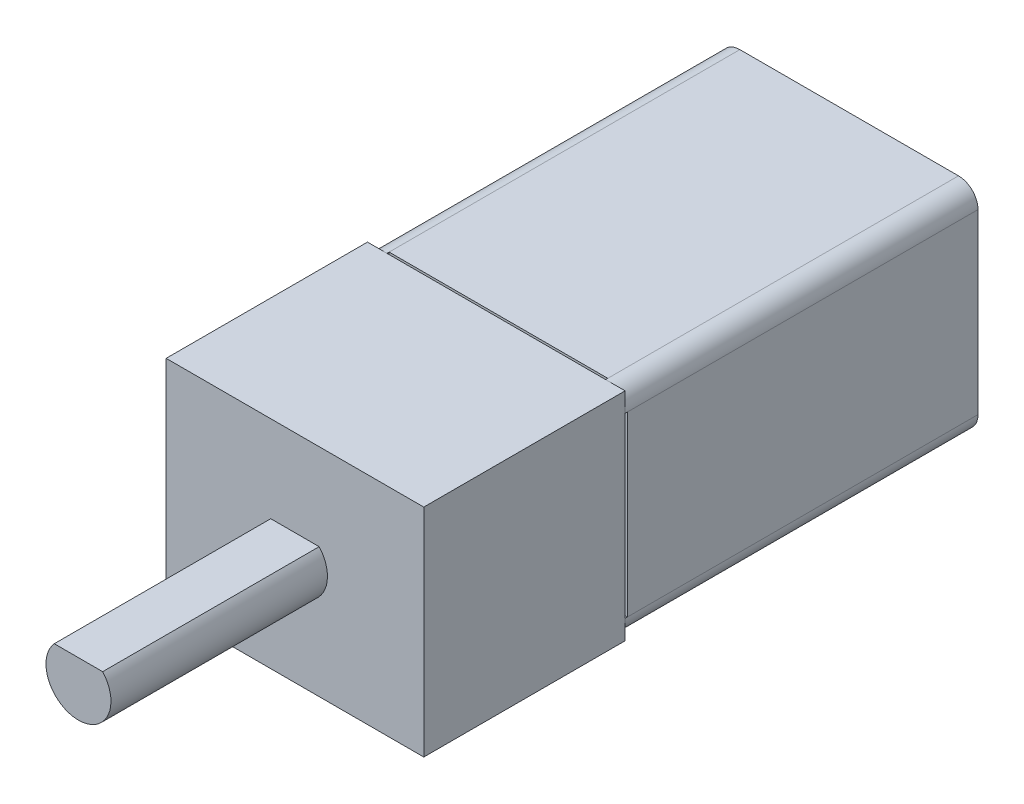
ISO-10303-21;
HEADER;
FILE_DESCRIPTION(('STEP AP214'),'2;1');
FILE_NAME('part.step','',(''),(''),'','','');
FILE_SCHEMA(('AUTOMOTIVE_DESIGN { 1 0 10303 214 1 1 1 1 }'));
ENDSEC;
DATA;
#1=APPLICATION_CONTEXT('core data for automotive mechanical design processes');
#2=APPLICATION_PROTOCOL_DEFINITION('international standard','automotive_design',2000,#1);
#3=PRODUCT_CONTEXT('',#1,'mechanical');
#4=PRODUCT('Part','Part','',(#3));
#5=PRODUCT_RELATED_PRODUCT_CATEGORY('part','',(#4));
#6=PRODUCT_DEFINITION_FORMATION('','',#4);
#7=PRODUCT_DEFINITION_CONTEXT('part definition',#1,'design');
#8=PRODUCT_DEFINITION('design','',#6,#7);
#9=PRODUCT_DEFINITION_SHAPE('','',#8);
#10=(LENGTH_UNIT() NAMED_UNIT(*) SI_UNIT(.MILLI.,.METRE.));
#11=(NAMED_UNIT(*) PLANE_ANGLE_UNIT() SI_UNIT($,.RADIAN.));
#12=(NAMED_UNIT(*) SI_UNIT($,.STERADIAN.) SOLID_ANGLE_UNIT());
#13=UNCERTAINTY_MEASURE_WITH_UNIT(LENGTH_MEASURE(1.E-05),#10,'distance_accuracy_value','');
#14=(GEOMETRIC_REPRESENTATION_CONTEXT(3) GLOBAL_UNCERTAINTY_ASSIGNED_CONTEXT((#13)) GLOBAL_UNIT_ASSIGNED_CONTEXT((#10,
#11,#12)) REPRESENTATION_CONTEXT('',''));
#15=CARTESIAN_POINT('',(0.,0.,0.));
#16=DIRECTION('',(0.,0.,1.));
#17=DIRECTION('',(1.,0.,0.));
#18=AXIS2_PLACEMENT_3D('',#15,#16,#17);
#19=CARTESIAN_POINT('',(0.,0.,0.));
#20=DIRECTION('',(0.,-1.,0.));
#21=DIRECTION('',(0.,0.,-1.));
#22=AXIS2_PLACEMENT_3D('',#19,#20,#21);
#23=PLANE('',#22);
#24=DIRECTION('',(1.,0.,0.));
#25=VECTOR('',#24,1.);
#26=CARTESIAN_POINT('',(11.,0.,-9.4));
#27=LINE('',#26,#25);
#28=CARTESIAN_POINT('',(0.900000000000006,0.,-9.4));
#29=VERTEX_POINT('',#28);
#30=CARTESIAN_POINT('',(11.,0.,-9.4));
#31=VERTEX_POINT('',#30);
#32=EDGE_CURVE('E231',#29,#31,#27,.T.);
#33=ORIENTED_EDGE('',*,*,#32,.F.);
#34=DIRECTION('',(0.,0.,1.));
#35=VECTOR('',#34,1.);
#36=CARTESIAN_POINT('',(0.900000000000006,0.,-25.6));
#37=LINE('',#36,#35);
#38=CARTESIAN_POINT('',(0.900000000000006,0.,-25.6));
#39=VERTEX_POINT('',#38);
#40=EDGE_CURVE('E382',#39,#29,#37,.T.);
#41=ORIENTED_EDGE('',*,*,#40,.F.);
#42=DIRECTION('',(-1.,0.,0.));
#43=VECTOR('',#42,1.);
#44=CARTESIAN_POINT('',(11.,0.,-25.6));
#45=LINE('',#44,#43);
#46=CARTESIAN_POINT('',(11.,0.,-25.6));
#47=VERTEX_POINT('',#46);
#48=EDGE_CURVE('E350',#47,#39,#45,.T.);
#49=ORIENTED_EDGE('',*,*,#48,.F.);
#50=DIRECTION('',(0.,0.,1.));
#51=VECTOR('',#50,1.);
#52=CARTESIAN_POINT('',(11.,0.,-25.6));
#53=LINE('',#52,#51);
#54=EDGE_CURVE('E385',#47,#31,#53,.T.);
#55=ORIENTED_EDGE('',*,*,#54,.T.);
#56=EDGE_LOOP('',(#33,#41,#49,#55));
#57=FACE_BOUND('',#56,.T.);
#58=ADVANCED_FACE('F34',(#57),#23,.T.);
#59=CARTESIAN_POINT('',(0.,10.,0.));
#60=DIRECTION('',(1.,0.,0.));
#61=DIRECTION('',(0.,0.,-1.));
#62=AXIS2_PLACEMENT_3D('',#59,#60,#61);
#63=PLANE('',#62);
#64=DIRECTION('',(0.,-1.,0.));
#65=VECTOR('',#64,1.);
#66=CARTESIAN_POINT('',(0.,10.,-9.3));
#67=LINE('',#66,#65);
#68=CARTESIAN_POINT('',(0.,10.,-9.3));
#69=VERTEX_POINT('',#68);
#70=CARTESIAN_POINT('',(0.,9.1,-9.3));
#71=VERTEX_POINT('',#70);
#72=EDGE_CURVE('E435',#69,#71,#67,.T.);
#73=ORIENTED_EDGE('',*,*,#72,.T.);
#74=DIRECTION('',(0.,1.,0.));
#75=VECTOR('',#74,1.);
#76=CARTESIAN_POINT('',(0.,0.9,-9.3));
#77=LINE('',#76,#75);
#78=CARTESIAN_POINT('',(0.,0.9,-9.3));
#79=VERTEX_POINT('',#78);
#80=EDGE_CURVE('E246',#79,#71,#77,.T.);
#81=ORIENTED_EDGE('',*,*,#80,.F.);
#82=CARTESIAN_POINT('',(0.,0.,-9.3));
#83=VERTEX_POINT('',#82);
#84=EDGE_CURVE('E424',#79,#83,#67,.T.);
#85=ORIENTED_EDGE('',*,*,#84,.T.);
#86=DIRECTION('',(0.,0.,1.));
#87=VECTOR('',#86,1.);
#88=CARTESIAN_POINT('',(0.,0.,0.));
#89=LINE('',#88,#87);
#90=CARTESIAN_POINT('',(0.,0.,0.));
#91=VERTEX_POINT('',#90);
#92=EDGE_CURVE('E411',#83,#91,#89,.T.);
#93=ORIENTED_EDGE('',*,*,#92,.T.);
#94=DIRECTION('',(0.,-1.,0.));
#95=VECTOR('',#94,1.);
#96=CARTESIAN_POINT('',(0.,10.,0.));
#97=LINE('',#96,#95);
#98=CARTESIAN_POINT('',(0.,10.,0.));
#99=VERTEX_POINT('',#98);
#100=EDGE_CURVE('E11',#99,#91,#97,.T.);
#101=ORIENTED_EDGE('',*,*,#100,.F.);
#102=DIRECTION('',(0.,0.,1.));
#103=VECTOR('',#102,1.);
#104=CARTESIAN_POINT('',(0.,10.,0.));
#105=LINE('',#104,#103);
#106=EDGE_CURVE('E412',#69,#99,#105,.T.);
#107=ORIENTED_EDGE('',*,*,#106,.F.);
#108=EDGE_LOOP('',(#73,#81,#85,#93,#101,#107));
#109=FACE_BOUND('',#108,.T.);
#110=ADVANCED_FACE('F496',(#109),#63,.F.);
#111=CARTESIAN_POINT('',(11.9,10.,0.));
#112=DIRECTION('',(-1.,0.,0.));
#113=DIRECTION('',(0.,0.,1.));
#114=AXIS2_PLACEMENT_3D('',#111,#112,#113);
#115=PLANE('',#114);
#116=DIRECTION('',(0.,-1.,0.));
#117=VECTOR('',#116,1.);
#118=CARTESIAN_POINT('',(11.9,10.,-9.3));
#119=LINE('',#118,#117);
#120=CARTESIAN_POINT('',(11.9,0.9,-9.3));
#121=VERTEX_POINT('',#120);
#122=CARTESIAN_POINT('',(11.9,0.,-9.3));
#123=VERTEX_POINT('',#122);
#124=EDGE_CURVE('E438',#121,#123,#119,.T.);
#125=ORIENTED_EDGE('',*,*,#124,.F.);
#126=DIRECTION('',(0.,-1.,0.));
#127=VECTOR('',#126,1.);
#128=CARTESIAN_POINT('',(11.9,9.1,-9.3));
#129=LINE('',#128,#127);
#130=CARTESIAN_POINT('',(11.9,9.1,-9.3));
#131=VERTEX_POINT('',#130);
#132=EDGE_CURVE('E57',#131,#121,#129,.T.);
#133=ORIENTED_EDGE('',*,*,#132,.F.);
#134=CARTESIAN_POINT('',(11.9,10.,-9.3));
#135=VERTEX_POINT('',#134);
#136=EDGE_CURVE('E439',#135,#131,#119,.T.);
#137=ORIENTED_EDGE('',*,*,#136,.F.);
#138=DIRECTION('',(0.,0.,-1.));
#139=VECTOR('',#138,1.);
#140=CARTESIAN_POINT('',(11.9,10.,0.));
#141=LINE('',#140,#139);
#142=CARTESIAN_POINT('',(11.9,10.,0.));
#143=VERTEX_POINT('',#142);
#144=EDGE_CURVE('E418',#143,#135,#141,.T.);
#145=ORIENTED_EDGE('',*,*,#144,.F.);
#146=DIRECTION('',(0.,-1.,0.));
#147=VECTOR('',#146,1.);
#148=CARTESIAN_POINT('',(11.9,10.,0.));
#149=LINE('',#148,#147);
#150=CARTESIAN_POINT('',(11.9,0.,0.));
#151=VERTEX_POINT('',#150);
#152=EDGE_CURVE('E42',#143,#151,#149,.T.);
#153=ORIENTED_EDGE('',*,*,#152,.T.);
#154=DIRECTION('',(0.,0.,-1.));
#155=VECTOR('',#154,1.);
#156=CARTESIAN_POINT('',(11.9,0.,0.));
#157=LINE('',#156,#155);
#158=EDGE_CURVE('E429',#151,#123,#157,.T.);
#159=ORIENTED_EDGE('',*,*,#158,.T.);
#160=EDGE_LOOP('',(#125,#133,#137,#145,#153,#159));
#161=FACE_BOUND('',#160,.T.);
#162=ADVANCED_FACE('F447',(#161),#115,.F.);
#163=CARTESIAN_POINT('',(0.,10.,0.));
#164=DIRECTION('',(0.,-1.,0.));
#165=DIRECTION('',(0.,0.,-1.));
#166=AXIS2_PLACEMENT_3D('',#163,#164,#165);
#167=PLANE('',#166);
#168=DIRECTION('',(0.,0.,1.));
#169=VECTOR('',#168,1.);
#170=CARTESIAN_POINT('',(0.900000000000006,10.,-25.6));
#171=LINE('',#170,#169);
#172=CARTESIAN_POINT('',(0.900000000000006,10.,-25.6));
#173=VERTEX_POINT('',#172);
#174=CARTESIAN_POINT('',(0.900000000000006,10.,-9.4));
#175=VERTEX_POINT('',#174);
#176=EDGE_CURVE('E373',#173,#175,#171,.T.);
#177=ORIENTED_EDGE('',*,*,#176,.T.);
#178=DIRECTION('',(-1.,0.,0.));
#179=VECTOR('',#178,1.);
#180=CARTESIAN_POINT('',(0.9,10.,-9.4));
#181=LINE('',#180,#179);
#182=CARTESIAN_POINT('',(11.,10.,-9.4));
#183=VERTEX_POINT('',#182);
#184=EDGE_CURVE('E49',#183,#175,#181,.T.);
#185=ORIENTED_EDGE('',*,*,#184,.F.);
#186=DIRECTION('',(0.,0.,1.));
#187=VECTOR('',#186,1.);
#188=CARTESIAN_POINT('',(11.,10.,-25.6));
#189=LINE('',#188,#187);
#190=CARTESIAN_POINT('',(11.,10.,-25.6));
#191=VERTEX_POINT('',#190);
#192=EDGE_CURVE('E360',#191,#183,#189,.T.);
#193=ORIENTED_EDGE('',*,*,#192,.F.);
#194=DIRECTION('',(1.,0.,0.));
#195=VECTOR('',#194,1.);
#196=CARTESIAN_POINT('',(11.,10.,-25.6));
#197=LINE('',#196,#195);
#198=EDGE_CURVE('E358',#173,#191,#197,.T.);
#199=ORIENTED_EDGE('',*,*,#198,.F.);
#200=EDGE_LOOP('',(#177,#185,#193,#199));
#201=FACE_BOUND('',#200,.T.);
#202=ADVANCED_FACE('F543',(#201),#167,.F.);
#203=CARTESIAN_POINT('',(0.,10.,-9.3));
#204=DIRECTION('',(0.,0.,1.));
#205=DIRECTION('',(1.,0.,0.));
#206=AXIS2_PLACEMENT_3D('',#203,#204,#205);
#207=PLANE('',#206);
#208=CARTESIAN_POINT('',(11.,9.1,-9.3));
#209=DIRECTION('',(0.,0.,-1.));
#210=DIRECTION('',(1.,0.,0.));
#211=AXIS2_PLACEMENT_3D('',#208,#209,#210);
#212=CIRCLE('',#211,0.9);
#213=CARTESIAN_POINT('',(11.,10.,-9.3));
#214=VERTEX_POINT('',#213);
#215=EDGE_CURVE('E336',#214,#131,#212,.T.);
#216=ORIENTED_EDGE('',*,*,#215,.F.);
#217=DIRECTION('',(-1.,0.,0.));
#218=VECTOR('',#217,1.);
#219=CARTESIAN_POINT('',(0.,10.,-9.3));
#220=LINE('',#219,#218);
#221=EDGE_CURVE('E421',#135,#214,#220,.T.);
#222=ORIENTED_EDGE('',*,*,#221,.F.);
#223=ORIENTED_EDGE('',*,*,#136,.T.);
#224=EDGE_LOOP('',(#216,#222,#223));
#225=FACE_BOUND('',#224,.T.);
#226=ADVANCED_FACE('F486',(#225),#207,.F.);
#227=CARTESIAN_POINT('',(0.9,9.1,-9.3));
#228=DIRECTION('',(0.,0.,-1.));
#229=DIRECTION('',(-1.,0.,0.));
#230=AXIS2_PLACEMENT_3D('',#227,#228,#229);
#231=CIRCLE('',#230,0.9);
#232=CARTESIAN_POINT('',(0.9,10.,-9.3));
#233=VERTEX_POINT('',#232);
#234=EDGE_CURVE('E346',#71,#233,#231,.T.);
#235=ORIENTED_EDGE('',*,*,#234,.F.);
#236=ORIENTED_EDGE('',*,*,#72,.F.);
#237=EDGE_CURVE('E420',#233,#69,#220,.T.);
#238=ORIENTED_EDGE('',*,*,#237,.F.);
#239=EDGE_LOOP('',(#235,#236,#238));
#240=FACE_BOUND('',#239,.T.);
#241=ADVANCED_FACE('F553',(#240),#207,.F.);
#242=CARTESIAN_POINT('',(0.9,0.9,-9.3));
#243=DIRECTION('',(0.,0.,-1.));
#244=DIRECTION('',(1.,0.,0.));
#245=AXIS2_PLACEMENT_3D('',#242,#243,#244);
#246=CIRCLE('',#245,0.9);
#247=CARTESIAN_POINT('',(0.9,0.,-9.3));
#248=VERTEX_POINT('',#247);
#249=EDGE_CURVE('E366',#248,#79,#246,.T.);
#250=ORIENTED_EDGE('',*,*,#249,.F.);
#251=DIRECTION('',(-1.,0.,0.));
#252=VECTOR('',#251,1.);
#253=CARTESIAN_POINT('',(0.,0.,-9.3));
#254=LINE('',#253,#252);
#255=EDGE_CURVE('E432',#248,#83,#254,.T.);
#256=ORIENTED_EDGE('',*,*,#255,.T.);
#257=ORIENTED_EDGE('',*,*,#84,.F.);
#258=EDGE_LOOP('',(#250,#256,#257));
#259=FACE_BOUND('',#258,.T.);
#260=ADVANCED_FACE('F502',(#259),#207,.F.);
#261=CARTESIAN_POINT('',(0.,10.,0.));
#262=DIRECTION('',(0.,0.,-1.));
#263=DIRECTION('',(-1.,0.,0.));
#264=AXIS2_PLACEMENT_3D('',#261,#262,#263);
#265=PLANE('',#264);
#266=DIRECTION('',(1.,0.,0.));
#267=VECTOR('',#266,1.);
#268=CARTESIAN_POINT('',(0.,0.,0.));
#269=LINE('',#268,#267);
#270=EDGE_CURVE('E427',#91,#151,#269,.T.);
#271=ORIENTED_EDGE('',*,*,#270,.T.);
#272=ORIENTED_EDGE('',*,*,#152,.F.);
#273=DIRECTION('',(1.,0.,0.));
#274=VECTOR('',#273,1.);
#275=CARTESIAN_POINT('',(0.,10.,0.));
#276=LINE('',#275,#274);
#277=EDGE_CURVE('E415',#99,#143,#276,.T.);
#278=ORIENTED_EDGE('',*,*,#277,.F.);
#279=ORIENTED_EDGE('',*,*,#100,.T.);
#280=EDGE_LOOP('',(#271,#272,#278,#279));
#281=FACE_BOUND('',#280,.T.);
#282=CARTESIAN_POINT('',(5.95,5.,0.));
#283=DIRECTION('',(0.,0.,1.));
#284=DIRECTION('',(1.,0.,0.));
#285=AXIS2_PLACEMENT_3D('',#282,#283,#284);
#286=CIRCLE('',#285,1.5);
#287=CARTESIAN_POINT('',(4.83196601125011,6.,0.));
#288=VERTEX_POINT('',#287);
#289=CARTESIAN_POINT('',(7.0680339887499,6.,0.));
#290=VERTEX_POINT('',#289);
#291=EDGE_CURVE('E394',#288,#290,#286,.T.);
#292=ORIENTED_EDGE('',*,*,#291,.F.);
#293=DIRECTION('',(-1.,0.,0.));
#294=VECTOR('',#293,1.);
#295=CARTESIAN_POINT('',(4.83196601125011,6.,0.));
#296=LINE('',#295,#294);
#297=EDGE_CURVE('E399',#290,#288,#296,.T.);
#298=ORIENTED_EDGE('',*,*,#297,.F.);
#299=EDGE_LOOP('',(#292,#298));
#300=FACE_BOUND('',#299,.T.);
#301=ADVANCED_FACE('F493',(#281,#300),#265,.F.);
#302=DIRECTION('',(0.,0.,1.));
#303=VECTOR('',#302,1.);
#304=CARTESIAN_POINT('',(0.,0.900000000000006,-25.6));
#305=LINE('',#304,#303);
#306=CARTESIAN_POINT('',(0.,0.900000000000006,-25.6));
#307=VERTEX_POINT('',#306);
#308=CARTESIAN_POINT('',(0.,0.9,-9.4));
#309=VERTEX_POINT('',#308);
#310=EDGE_CURVE('E379',#307,#309,#305,.T.);
#311=ORIENTED_EDGE('',*,*,#310,.T.);
#312=DIRECTION('',(0.,-1.,0.));
#313=VECTOR('',#312,1.);
#314=CARTESIAN_POINT('',(0.,0.9,-9.4));
#315=LINE('',#314,#313);
#316=CARTESIAN_POINT('',(0.,9.09999999999999,-9.4));
#317=VERTEX_POINT('',#316);
#318=EDGE_CURVE('E268',#317,#309,#315,.T.);
#319=ORIENTED_EDGE('',*,*,#318,.F.);
#320=DIRECTION('',(0.,0.,1.));
#321=VECTOR('',#320,1.);
#322=CARTESIAN_POINT('',(0.,9.09999999999999,-25.6));
#323=LINE('',#322,#321);
#324=CARTESIAN_POINT('',(0.,9.09999999999999,-25.6));
#325=VERTEX_POINT('',#324);
#326=EDGE_CURVE('E376',#325,#317,#323,.T.);
#327=ORIENTED_EDGE('',*,*,#326,.F.);
#328=DIRECTION('',(0.,1.,0.));
#329=VECTOR('',#328,1.);
#330=CARTESIAN_POINT('',(0.,9.09999999999999,-25.6));
#331=LINE('',#330,#329);
#332=EDGE_CURVE('E354',#307,#325,#331,.T.);
#333=ORIENTED_EDGE('',*,*,#332,.F.);
#334=EDGE_LOOP('',(#311,#319,#327,#333));
#335=FACE_BOUND('',#334,.T.);
#336=ADVANCED_FACE('F36',(#335),#63,.F.);
#337=DIRECTION('',(0.,0.,1.));
#338=VECTOR('',#337,1.);
#339=CARTESIAN_POINT('',(11.9,9.09999999999999,-25.6));
#340=LINE('',#339,#338);
#341=CARTESIAN_POINT('',(11.9,9.09999999999999,-25.6));
#342=VERTEX_POINT('',#341);
#343=CARTESIAN_POINT('',(11.9,9.1,-9.4));
#344=VERTEX_POINT('',#343);
#345=EDGE_CURVE('E391',#342,#344,#340,.T.);
#346=ORIENTED_EDGE('',*,*,#345,.T.);
#347=DIRECTION('',(0.,1.,0.));
#348=VECTOR('',#347,1.);
#349=CARTESIAN_POINT('',(11.9,9.1,-9.4));
#350=LINE('',#349,#348);
#351=CARTESIAN_POINT('',(11.9,0.900000000000006,-9.4));
#352=VERTEX_POINT('',#351);
#353=EDGE_CURVE('E299',#352,#344,#350,.T.);
#354=ORIENTED_EDGE('',*,*,#353,.F.);
#355=DIRECTION('',(0.,0.,1.));
#356=VECTOR('',#355,1.);
#357=CARTESIAN_POINT('',(11.9,0.900000000000006,-25.6));
#358=LINE('',#357,#356);
#359=CARTESIAN_POINT('',(11.9,0.900000000000006,-25.6));
#360=VERTEX_POINT('',#359);
#361=EDGE_CURVE('E388',#360,#352,#358,.T.);
#362=ORIENTED_EDGE('',*,*,#361,.F.);
#363=DIRECTION('',(0.,-1.,0.));
#364=VECTOR('',#363,1.);
#365=CARTESIAN_POINT('',(11.9,9.09999999999999,-25.6));
#366=LINE('',#365,#364);
#367=EDGE_CURVE('E345',#342,#360,#366,.T.);
#368=ORIENTED_EDGE('',*,*,#367,.F.);
#369=EDGE_LOOP('',(#346,#354,#362,#368));
#370=FACE_BOUND('',#369,.T.);
#371=ADVANCED_FACE('F470',(#370),#115,.F.);
#372=CARTESIAN_POINT('',(11.,0.9,-9.3));
#373=DIRECTION('',(0.,0.,-1.));
#374=DIRECTION('',(1.,0.,0.));
#375=AXIS2_PLACEMENT_3D('',#372,#373,#374);
#376=CIRCLE('',#375,0.9);
#377=CARTESIAN_POINT('',(11.,0.,-9.3));
#378=VERTEX_POINT('',#377);
#379=EDGE_CURVE('E363',#121,#378,#376,.T.);
#380=ORIENTED_EDGE('',*,*,#379,.F.);
#381=ORIENTED_EDGE('',*,*,#124,.T.);
#382=EDGE_CURVE('E416',#123,#378,#254,.T.);
#383=ORIENTED_EDGE('',*,*,#382,.T.);
#384=EDGE_LOOP('',(#380,#381,#383));
#385=FACE_BOUND('',#384,.T.);
#386=ADVANCED_FACE('F457',(#385),#207,.F.);
#387=ORIENTED_EDGE('',*,*,#221,.T.);
#388=DIRECTION('',(1.,0.,0.));
#389=VECTOR('',#388,1.);
#390=CARTESIAN_POINT('',(0.9,10.,-9.3));
#391=LINE('',#390,#389);
#392=EDGE_CURVE('E327',#233,#214,#391,.T.);
#393=ORIENTED_EDGE('',*,*,#392,.F.);
#394=ORIENTED_EDGE('',*,*,#237,.T.);
#395=ORIENTED_EDGE('',*,*,#106,.T.);
#396=ORIENTED_EDGE('',*,*,#277,.T.);
#397=ORIENTED_EDGE('',*,*,#144,.T.);
#398=EDGE_LOOP('',(#387,#393,#394,#395,#396,#397));
#399=FACE_BOUND('',#398,.T.);
#400=ADVANCED_FACE('F489',(#399),#167,.F.);
#401=DIRECTION('',(-1.,0.,0.));
#402=VECTOR('',#401,1.);
#403=CARTESIAN_POINT('',(11.,0.,-9.3));
#404=LINE('',#403,#402);
#405=EDGE_CURVE('E240',#378,#248,#404,.T.);
#406=ORIENTED_EDGE('',*,*,#405,.F.);
#407=ORIENTED_EDGE('',*,*,#382,.F.);
#408=ORIENTED_EDGE('',*,*,#158,.F.);
#409=ORIENTED_EDGE('',*,*,#270,.F.);
#410=ORIENTED_EDGE('',*,*,#92,.F.);
#411=ORIENTED_EDGE('',*,*,#255,.F.);
#412=EDGE_LOOP('',(#406,#407,#408,#409,#410,#411));
#413=FACE_BOUND('',#412,.T.);
#414=ADVANCED_FACE('F452',(#413),#23,.T.);
#415=CARTESIAN_POINT('',(5.95,5.,10.));
#416=DIRECTION('',(0.,0.,-1.));
#417=DIRECTION('',(-1.,0.,0.));
#418=AXIS2_PLACEMENT_3D('',#415,#416,#417);
#419=CYLINDRICAL_SURFACE('',#418,1.5);
#420=ORIENTED_EDGE('',*,*,#291,.T.);
#421=DIRECTION('',(0.,0.,-1.));
#422=VECTOR('',#421,1.);
#423=CARTESIAN_POINT('',(7.0680339887499,6.,10.));
#424=LINE('',#423,#422);
#425=CARTESIAN_POINT('',(7.0680339887499,6.,10.));
#426=VERTEX_POINT('',#425);
#427=EDGE_CURVE('E408',#426,#290,#424,.T.);
#428=ORIENTED_EDGE('',*,*,#427,.F.);
#429=CARTESIAN_POINT('',(5.95,5.,10.));
#430=DIRECTION('',(0.,0.,1.));
#431=DIRECTION('',(1.,0.,0.));
#432=AXIS2_PLACEMENT_3D('',#429,#430,#431);
#433=CIRCLE('',#432,1.5);
#434=CARTESIAN_POINT('',(4.83196601125011,6.,10.));
#435=VERTEX_POINT('',#434);
#436=EDGE_CURVE('E395',#435,#426,#433,.T.);
#437=ORIENTED_EDGE('',*,*,#436,.F.);
#438=DIRECTION('',(0.,0.,-1.));
#439=VECTOR('',#438,1.);
#440=CARTESIAN_POINT('',(4.83196601125011,6.,10.));
#441=LINE('',#440,#439);
#442=EDGE_CURVE('E401',#435,#288,#441,.T.);
#443=ORIENTED_EDGE('',*,*,#442,.T.);
#444=EDGE_LOOP('',(#420,#428,#437,#443));
#445=FACE_BOUND('',#444,.T.);
#446=ADVANCED_FACE('F535',(#445),#419,.T.);
#447=CARTESIAN_POINT('',(4.83196601125011,6.,10.));
#448=DIRECTION('',(0.,-1.,0.));
#449=DIRECTION('',(0.,0.,-1.));
#450=AXIS2_PLACEMENT_3D('',#447,#448,#449);
#451=PLANE('',#450);
#452=ORIENTED_EDGE('',*,*,#297,.T.);
#453=ORIENTED_EDGE('',*,*,#442,.F.);
#454=DIRECTION('',(-1.,0.,0.));
#455=VECTOR('',#454,1.);
#456=CARTESIAN_POINT('',(4.83196601125011,6.,10.));
#457=LINE('',#456,#455);
#458=EDGE_CURVE('E398',#426,#435,#457,.T.);
#459=ORIENTED_EDGE('',*,*,#458,.F.);
#460=ORIENTED_EDGE('',*,*,#427,.T.);
#461=EDGE_LOOP('',(#452,#453,#459,#460));
#462=FACE_BOUND('',#461,.T.);
#463=ADVANCED_FACE('F540',(#462),#451,.F.);
#464=CARTESIAN_POINT('',(5.95,5.,10.));
#465=DIRECTION('',(0.,0.,1.));
#466=DIRECTION('',(1.,0.,0.));
#467=AXIS2_PLACEMENT_3D('',#464,#465,#466);
#468=PLANE('',#467);
#469=ORIENTED_EDGE('',*,*,#436,.T.);
#470=ORIENTED_EDGE('',*,*,#458,.T.);
#471=EDGE_LOOP('',(#469,#470));
#472=FACE_BOUND('',#471,.T.);
#473=ADVANCED_FACE('F643',(#472),#468,.T.);
#474=CARTESIAN_POINT('',(11.,9.1,-25.6));
#475=DIRECTION('',(0.,0.,1.));
#476=DIRECTION('',(1.,0.,0.));
#477=AXIS2_PLACEMENT_3D('',#474,#475,#476);
#478=CYLINDRICAL_SURFACE('',#477,0.9);
#479=ORIENTED_EDGE('',*,*,#215,.T.);
#480=DIRECTION('',(0.,0.,1.));
#481=VECTOR('',#480,1.);
#482=CARTESIAN_POINT('',(11.9,9.1,-9.3));
#483=LINE('',#482,#481);
#484=EDGE_CURVE('E285',#344,#131,#483,.T.);
#485=ORIENTED_EDGE('',*,*,#484,.F.);
#486=ORIENTED_EDGE('',*,*,#345,.F.);
#487=CARTESIAN_POINT('',(11.,9.1,-25.6));
#488=DIRECTION('',(0.,0.,-1.));
#489=DIRECTION('',(1.,0.,0.));
#490=AXIS2_PLACEMENT_3D('',#487,#488,#489);
#491=CIRCLE('',#490,0.9);
#492=EDGE_CURVE('E342',#191,#342,#491,.T.);
#493=ORIENTED_EDGE('',*,*,#492,.F.);
#494=ORIENTED_EDGE('',*,*,#192,.T.);
#495=DIRECTION('',(0.,0.,-1.));
#496=VECTOR('',#495,1.);
#497=CARTESIAN_POINT('',(11.,10.,-9.3));
#498=LINE('',#497,#496);
#499=EDGE_CURVE('E330',#214,#183,#498,.T.);
#500=ORIENTED_EDGE('',*,*,#499,.F.);
#501=EDGE_LOOP('',(#479,#485,#486,#493,#494,#500));
#502=FACE_BOUND('',#501,.T.);
#503=ADVANCED_FACE('F476',(#502),#478,.T.);
#504=CARTESIAN_POINT('',(11.,0.9,-25.6));
#505=DIRECTION('',(0.,0.,1.));
#506=DIRECTION('',(1.,0.,0.));
#507=AXIS2_PLACEMENT_3D('',#504,#505,#506);
#508=CYLINDRICAL_SURFACE('',#507,0.9);
#509=ORIENTED_EDGE('',*,*,#379,.T.);
#510=DIRECTION('',(0.,0.,1.));
#511=VECTOR('',#510,1.);
#512=CARTESIAN_POINT('',(11.,0.,-9.3));
#513=LINE('',#512,#511);
#514=EDGE_CURVE('E214',#31,#378,#513,.T.);
#515=ORIENTED_EDGE('',*,*,#514,.F.);
#516=ORIENTED_EDGE('',*,*,#54,.F.);
#517=CARTESIAN_POINT('',(11.,0.9,-25.6));
#518=DIRECTION('',(0.,0.,-1.));
#519=DIRECTION('',(1.,0.,0.));
#520=AXIS2_PLACEMENT_3D('',#517,#518,#519);
#521=CIRCLE('',#520,0.9);
#522=EDGE_CURVE('E348',#360,#47,#521,.T.);
#523=ORIENTED_EDGE('',*,*,#522,.F.);
#524=ORIENTED_EDGE('',*,*,#361,.T.);
#525=DIRECTION('',(0.,0.,-1.));
#526=VECTOR('',#525,1.);
#527=CARTESIAN_POINT('',(11.9,0.9,-9.3));
#528=LINE('',#527,#526);
#529=EDGE_CURVE('E296',#121,#352,#528,.T.);
#530=ORIENTED_EDGE('',*,*,#529,.F.);
#531=EDGE_LOOP('',(#509,#515,#516,#523,#524,#530));
#532=FACE_BOUND('',#531,.T.);
#533=ADVANCED_FACE('F460',(#532),#508,.T.);
#534=CARTESIAN_POINT('',(0.9,0.9,-25.6));
#535=DIRECTION('',(0.,0.,1.));
#536=DIRECTION('',(1.,0.,0.));
#537=AXIS2_PLACEMENT_3D('',#534,#535,#536);
#538=CYLINDRICAL_SURFACE('',#537,0.9);
#539=ORIENTED_EDGE('',*,*,#249,.T.);
#540=DIRECTION('',(0.,0.,1.));
#541=VECTOR('',#540,1.);
#542=CARTESIAN_POINT('',(0.,0.9,-9.3));
#543=LINE('',#542,#541);
#544=EDGE_CURVE('E254',#309,#79,#543,.T.);
#545=ORIENTED_EDGE('',*,*,#544,.F.);
#546=ORIENTED_EDGE('',*,*,#310,.F.);
#547=CARTESIAN_POINT('',(0.9,0.9,-25.6));
#548=DIRECTION('',(0.,0.,-1.));
#549=DIRECTION('',(1.,0.,0.));
#550=AXIS2_PLACEMENT_3D('',#547,#548,#549);
#551=CIRCLE('',#550,0.9);
#552=EDGE_CURVE('E352',#39,#307,#551,.T.);
#553=ORIENTED_EDGE('',*,*,#552,.F.);
#554=ORIENTED_EDGE('',*,*,#40,.T.);
#555=DIRECTION('',(0.,0.,-1.));
#556=VECTOR('',#555,1.);
#557=CARTESIAN_POINT('',(0.9,0.,-9.3));
#558=LINE('',#557,#556);
#559=EDGE_CURVE('E234',#248,#29,#558,.T.);
#560=ORIENTED_EDGE('',*,*,#559,.F.);
#561=EDGE_LOOP('',(#539,#545,#546,#553,#554,#560));
#562=FACE_BOUND('',#561,.T.);
#563=ADVANCED_FACE('F506',(#562),#538,.T.);
#564=CARTESIAN_POINT('',(0.9,9.1,-25.6));
#565=DIRECTION('',(0.,0.,1.));
#566=DIRECTION('',(1.,0.,0.));
#567=AXIS2_PLACEMENT_3D('',#564,#565,#566);
#568=CYLINDRICAL_SURFACE('',#567,0.9);
#569=ORIENTED_EDGE('',*,*,#234,.T.);
#570=DIRECTION('',(0.,0.,1.));
#571=VECTOR('',#570,1.);
#572=CARTESIAN_POINT('',(0.9,10.,-9.3));
#573=LINE('',#572,#571);
#574=EDGE_CURVE('E306',#175,#233,#573,.T.);
#575=ORIENTED_EDGE('',*,*,#574,.F.);
#576=ORIENTED_EDGE('',*,*,#176,.F.);
#577=CARTESIAN_POINT('',(0.9,9.1,-25.6));
#578=DIRECTION('',(0.,0.,-1.));
#579=DIRECTION('',(-1.,0.,0.));
#580=AXIS2_PLACEMENT_3D('',#577,#578,#579);
#581=CIRCLE('',#580,0.9);
#582=EDGE_CURVE('E356',#325,#173,#581,.T.);
#583=ORIENTED_EDGE('',*,*,#582,.F.);
#584=ORIENTED_EDGE('',*,*,#326,.T.);
#585=DIRECTION('',(0.,0.,-1.));
#586=VECTOR('',#585,1.);
#587=CARTESIAN_POINT('',(0.,9.1,-9.3));
#588=LINE('',#587,#586);
#589=EDGE_CURVE('E265',#71,#317,#588,.T.);
#590=ORIENTED_EDGE('',*,*,#589,.F.);
#591=EDGE_LOOP('',(#569,#575,#576,#583,#584,#590));
#592=FACE_BOUND('',#591,.T.);
#593=ADVANCED_FACE('F561',(#592),#568,.T.);
#594=CARTESIAN_POINT('',(11.,9.1,-25.6));
#595=DIRECTION('',(0.,0.,1.));
#596=DIRECTION('',(1.,0.,0.));
#597=AXIS2_PLACEMENT_3D('',#594,#595,#596);
#598=PLANE('',#597);
#599=ORIENTED_EDGE('',*,*,#492,.T.);
#600=ORIENTED_EDGE('',*,*,#367,.T.);
#601=ORIENTED_EDGE('',*,*,#522,.T.);
#602=ORIENTED_EDGE('',*,*,#48,.T.);
#603=ORIENTED_EDGE('',*,*,#552,.T.);
#604=ORIENTED_EDGE('',*,*,#332,.T.);
#605=ORIENTED_EDGE('',*,*,#582,.T.);
#606=ORIENTED_EDGE('',*,*,#198,.T.);
#607=EDGE_LOOP('',(#599,#600,#601,#602,#603,#604,#605,#606));
#608=FACE_BOUND('',#607,.T.);
#609=ADVANCED_FACE('F576',(#608),#598,.F.);
#610=CARTESIAN_POINT('',(0.9,9.9,-9.3));
#611=DIRECTION('',(-1.,0.,0.));
#612=DIRECTION('',(0.,0.,1.));
#613=AXIS2_PLACEMENT_3D('',#610,#611,#612);
#614=PLANE('',#613);
#615=ORIENTED_EDGE('',*,*,#574,.T.);
#616=DIRECTION('',(0.,1.,0.));
#617=VECTOR('',#616,1.);
#618=CARTESIAN_POINT('',(0.9,9.9,-9.3));
#619=LINE('',#618,#617);
#620=CARTESIAN_POINT('',(0.9,9.9,-9.3));
#621=VERTEX_POINT('',#620);
#622=EDGE_CURVE('E324',#621,#233,#619,.T.);
#623=ORIENTED_EDGE('',*,*,#622,.F.);
#624=DIRECTION('',(0.,0.,1.));
#625=VECTOR('',#624,1.);
#626=CARTESIAN_POINT('',(0.9,9.9,-9.3));
#627=LINE('',#626,#625);
#628=CARTESIAN_POINT('',(0.9,9.9,-9.4));
#629=VERTEX_POINT('',#628);
#630=EDGE_CURVE('E312',#629,#621,#627,.T.);
#631=ORIENTED_EDGE('',*,*,#630,.F.);
#632=DIRECTION('',(0.,1.,0.));
#633=VECTOR('',#632,1.);
#634=CARTESIAN_POINT('',(0.9,9.9,-9.4));
#635=LINE('',#634,#633);
#636=EDGE_CURVE('E334',#629,#175,#635,.T.);
#637=ORIENTED_EDGE('',*,*,#636,.T.);
#638=EDGE_LOOP('',(#615,#623,#631,#637));
#639=FACE_BOUND('',#638,.T.);
#640=ADVANCED_FACE('F565',(#639),#614,.F.);
#641=CARTESIAN_POINT('',(0.9,9.9,-9.4));
#642=DIRECTION('',(0.,0.,-1.));
#643=DIRECTION('',(-1.,0.,0.));
#644=AXIS2_PLACEMENT_3D('',#641,#642,#643);
#645=PLANE('',#644);
#646=ORIENTED_EDGE('',*,*,#184,.T.);
#647=ORIENTED_EDGE('',*,*,#636,.F.);
#648=DIRECTION('',(-1.,0.,0.));
#649=VECTOR('',#648,1.);
#650=CARTESIAN_POINT('',(0.9,9.9,-9.4));
#651=LINE('',#650,#649);
#652=CARTESIAN_POINT('',(11.,9.9,-9.4));
#653=VERTEX_POINT('',#652);
#654=EDGE_CURVE('E321',#653,#629,#651,.T.);
#655=ORIENTED_EDGE('',*,*,#654,.F.);
#656=DIRECTION('',(0.,1.,0.));
#657=VECTOR('',#656,1.);
#658=CARTESIAN_POINT('',(11.,9.9,-9.4));
#659=LINE('',#658,#657);
#660=EDGE_CURVE('E337',#653,#183,#659,.T.);
#661=ORIENTED_EDGE('',*,*,#660,.T.);
#662=EDGE_LOOP('',(#646,#647,#655,#661));
#663=FACE_BOUND('',#662,.T.);
#664=ADVANCED_FACE('F569',(#663),#645,.F.);
#665=CARTESIAN_POINT('',(11.,9.9,-9.3));
#666=DIRECTION('',(1.,0.,0.));
#667=DIRECTION('',(0.,0.,-1.));
#668=AXIS2_PLACEMENT_3D('',#665,#666,#667);
#669=PLANE('',#668);
#670=ORIENTED_EDGE('',*,*,#499,.T.);
#671=ORIENTED_EDGE('',*,*,#660,.F.);
#672=DIRECTION('',(0.,0.,-1.));
#673=VECTOR('',#672,1.);
#674=CARTESIAN_POINT('',(11.,9.9,-9.3));
#675=LINE('',#674,#673);
#676=CARTESIAN_POINT('',(11.,9.9,-9.3));
#677=VERTEX_POINT('',#676);
#678=EDGE_CURVE('E318',#677,#653,#675,.T.);
#679=ORIENTED_EDGE('',*,*,#678,.F.);
#680=DIRECTION('',(0.,1.,0.));
#681=VECTOR('',#680,1.);
#682=CARTESIAN_POINT('',(11.,9.9,-9.3));
#683=LINE('',#682,#681);
#684=EDGE_CURVE('E339',#677,#214,#683,.T.);
#685=ORIENTED_EDGE('',*,*,#684,.T.);
#686=EDGE_LOOP('',(#670,#671,#679,#685));
#687=FACE_BOUND('',#686,.T.);
#688=ADVANCED_FACE('F574',(#687),#669,.F.);
#689=CARTESIAN_POINT('',(0.9,9.9,-9.3));
#690=DIRECTION('',(0.,0.,1.));
#691=DIRECTION('',(1.,0.,0.));
#692=AXIS2_PLACEMENT_3D('',#689,#690,#691);
#693=PLANE('',#692);
#694=ORIENTED_EDGE('',*,*,#392,.T.);
#695=ORIENTED_EDGE('',*,*,#684,.F.);
#696=DIRECTION('',(1.,0.,0.));
#697=VECTOR('',#696,1.);
#698=CARTESIAN_POINT('',(0.9,9.9,-9.3));
#699=LINE('',#698,#697);
#700=EDGE_CURVE('E315',#621,#677,#699,.T.);
#701=ORIENTED_EDGE('',*,*,#700,.F.);
#702=ORIENTED_EDGE('',*,*,#622,.T.);
#703=EDGE_LOOP('',(#694,#695,#701,#702));
#704=FACE_BOUND('',#703,.T.);
#705=ADVANCED_FACE('F623',(#704),#693,.F.);
#706=CARTESIAN_POINT('',(0.,9.9,0.));
#707=DIRECTION('',(0.,-1.,0.));
#708=DIRECTION('',(0.,0.,-1.));
#709=AXIS2_PLACEMENT_3D('',#706,#707,#708);
#710=PLANE('',#709);
#711=ORIENTED_EDGE('',*,*,#630,.T.);
#712=ORIENTED_EDGE('',*,*,#700,.T.);
#713=ORIENTED_EDGE('',*,*,#678,.T.);
#714=ORIENTED_EDGE('',*,*,#654,.T.);
#715=EDGE_LOOP('',(#711,#712,#713,#714));
#716=FACE_BOUND('',#715,.T.);
#717=ADVANCED_FACE('F571',(#716),#710,.F.);
#718=CARTESIAN_POINT('',(11.8,9.1,-9.3));
#719=DIRECTION('',(0.,0.,1.));
#720=DIRECTION('',(1.,0.,0.));
#721=AXIS2_PLACEMENT_3D('',#718,#719,#720);
#722=PLANE('',#721);
#723=ORIENTED_EDGE('',*,*,#132,.T.);
#724=DIRECTION('',(1.,0.,0.));
#725=VECTOR('',#724,1.);
#726=CARTESIAN_POINT('',(11.8,0.9,-9.3));
#727=LINE('',#726,#725);
#728=CARTESIAN_POINT('',(11.8,0.9,-9.3));
#729=VERTEX_POINT('',#728);
#730=EDGE_CURVE('E294',#729,#121,#727,.T.);
#731=ORIENTED_EDGE('',*,*,#730,.F.);
#732=DIRECTION('',(0.,-1.,0.));
#733=VECTOR('',#732,1.);
#734=CARTESIAN_POINT('',(11.8,9.1,-9.3));
#735=LINE('',#734,#733);
#736=CARTESIAN_POINT('',(11.8,9.1,-9.3));
#737=VERTEX_POINT('',#736);
#738=EDGE_CURVE('E281',#737,#729,#735,.T.);
#739=ORIENTED_EDGE('',*,*,#738,.F.);
#740=DIRECTION('',(1.,0.,0.));
#741=VECTOR('',#740,1.);
#742=CARTESIAN_POINT('',(11.8,9.1,-9.3));
#743=LINE('',#742,#741);
#744=EDGE_CURVE('E304',#737,#131,#743,.T.);
#745=ORIENTED_EDGE('',*,*,#744,.T.);
#746=EDGE_LOOP('',(#723,#731,#739,#745));
#747=FACE_BOUND('',#746,.T.);
#748=ADVANCED_FACE('F614',(#747),#722,.F.);
#749=CARTESIAN_POINT('',(11.8,9.1,-9.3));
#750=DIRECTION('',(0.,1.,0.));
#751=DIRECTION('',(0.,0.,1.));
#752=AXIS2_PLACEMENT_3D('',#749,#750,#751);
#753=PLANE('',#752);
#754=ORIENTED_EDGE('',*,*,#484,.T.);
#755=ORIENTED_EDGE('',*,*,#744,.F.);
#756=DIRECTION('',(0.,0.,1.));
#757=VECTOR('',#756,1.);
#758=CARTESIAN_POINT('',(11.8,9.1,-9.3));
#759=LINE('',#758,#757);
#760=CARTESIAN_POINT('',(11.8,9.1,-9.4));
#761=VERTEX_POINT('',#760);
#762=EDGE_CURVE('E291',#761,#737,#759,.T.);
#763=ORIENTED_EDGE('',*,*,#762,.F.);
#764=DIRECTION('',(1.,0.,0.));
#765=VECTOR('',#764,1.);
#766=CARTESIAN_POINT('',(11.8,9.1,-9.4));
#767=LINE('',#766,#765);
#768=EDGE_CURVE('E307',#761,#344,#767,.T.);
#769=ORIENTED_EDGE('',*,*,#768,.T.);
#770=EDGE_LOOP('',(#754,#755,#763,#769));
#771=FACE_BOUND('',#770,.T.);
#772=ADVANCED_FACE('F481',(#771),#753,.F.);
#773=CARTESIAN_POINT('',(11.8,9.1,-9.4));
#774=DIRECTION('',(0.,0.,-1.));
#775=DIRECTION('',(-1.,0.,0.));
#776=AXIS2_PLACEMENT_3D('',#773,#774,#775);
#777=PLANE('',#776);
#778=ORIENTED_EDGE('',*,*,#353,.T.);
#779=ORIENTED_EDGE('',*,*,#768,.F.);
#780=DIRECTION('',(0.,1.,0.));
#781=VECTOR('',#780,1.);
#782=CARTESIAN_POINT('',(11.8,9.1,-9.4));
#783=LINE('',#782,#781);
#784=CARTESIAN_POINT('',(11.8,0.900000000000006,-9.4));
#785=VERTEX_POINT('',#784);
#786=EDGE_CURVE('E288',#785,#761,#783,.T.);
#787=ORIENTED_EDGE('',*,*,#786,.F.);
#788=DIRECTION('',(1.,0.,0.));
#789=VECTOR('',#788,1.);
#790=CARTESIAN_POINT('',(11.8,0.900000000000006,-9.4));
#791=LINE('',#790,#789);
#792=EDGE_CURVE('E309',#785,#352,#791,.T.);
#793=ORIENTED_EDGE('',*,*,#792,.T.);
#794=EDGE_LOOP('',(#778,#779,#787,#793));
#795=FACE_BOUND('',#794,.T.);
#796=ADVANCED_FACE('F474',(#795),#777,.F.);
#797=CARTESIAN_POINT('',(11.8,0.9,-9.3));
#798=DIRECTION('',(0.,-1.,0.));
#799=DIRECTION('',(0.,0.,-1.));
#800=AXIS2_PLACEMENT_3D('',#797,#798,#799);
#801=PLANE('',#800);
#802=ORIENTED_EDGE('',*,*,#529,.T.);
#803=ORIENTED_EDGE('',*,*,#792,.F.);
#804=DIRECTION('',(0.,0.,-1.));
#805=VECTOR('',#804,1.);
#806=CARTESIAN_POINT('',(11.8,0.9,-9.3));
#807=LINE('',#806,#805);
#808=EDGE_CURVE('E284',#729,#785,#807,.T.);
#809=ORIENTED_EDGE('',*,*,#808,.F.);
#810=ORIENTED_EDGE('',*,*,#730,.T.);
#811=EDGE_LOOP('',(#802,#803,#809,#810));
#812=FACE_BOUND('',#811,.T.);
#813=ADVANCED_FACE('F466',(#812),#801,.F.);
#814=CARTESIAN_POINT('',(11.8,0.,0.));
#815=DIRECTION('',(1.,0.,0.));
#816=DIRECTION('',(0.,0.,-1.));
#817=AXIS2_PLACEMENT_3D('',#814,#815,#816);
#818=PLANE('',#817);
#819=ORIENTED_EDGE('',*,*,#738,.T.);
#820=ORIENTED_EDGE('',*,*,#808,.T.);
#821=ORIENTED_EDGE('',*,*,#786,.T.);
#822=ORIENTED_EDGE('',*,*,#762,.T.);
#823=EDGE_LOOP('',(#819,#820,#821,#822));
#824=FACE_BOUND('',#823,.T.);
#825=ADVANCED_FACE('F608',(#824),#818,.T.);
#826=CARTESIAN_POINT('',(0.1,0.9,-9.3));
#827=DIRECTION('',(0.,0.,1.));
#828=DIRECTION('',(1.,0.,0.));
#829=AXIS2_PLACEMENT_3D('',#826,#827,#828);
#830=PLANE('',#829);
#831=ORIENTED_EDGE('',*,*,#80,.T.);
#832=DIRECTION('',(-1.,0.,0.));
#833=VECTOR('',#832,1.);
#834=CARTESIAN_POINT('',(0.1,9.1,-9.3));
#835=LINE('',#834,#833);
#836=CARTESIAN_POINT('',(0.1,9.1,-9.3));
#837=VERTEX_POINT('',#836);
#838=EDGE_CURVE('E263',#837,#71,#835,.T.);
#839=ORIENTED_EDGE('',*,*,#838,.F.);
#840=DIRECTION('',(0.,1.,0.));
#841=VECTOR('',#840,1.);
#842=CARTESIAN_POINT('',(0.1,0.9,-9.3));
#843=LINE('',#842,#841);
#844=CARTESIAN_POINT('',(0.1,0.9,-9.3));
#845=VERTEX_POINT('',#844);
#846=EDGE_CURVE('E250',#845,#837,#843,.T.);
#847=ORIENTED_EDGE('',*,*,#846,.F.);
#848=DIRECTION('',(-1.,0.,0.));
#849=VECTOR('',#848,1.);
#850=CARTESIAN_POINT('',(0.1,0.9,-9.3));
#851=LINE('',#850,#849);
#852=EDGE_CURVE('E273',#845,#79,#851,.T.);
#853=ORIENTED_EDGE('',*,*,#852,.T.);
#854=EDGE_LOOP('',(#831,#839,#847,#853));
#855=FACE_BOUND('',#854,.T.);
#856=ADVANCED_FACE('F585',(#855),#830,.F.);
#857=CARTESIAN_POINT('',(0.1,0.9,-9.3));
#858=DIRECTION('',(0.,-1.,0.));
#859=DIRECTION('',(0.,0.,-1.));
#860=AXIS2_PLACEMENT_3D('',#857,#858,#859);
#861=PLANE('',#860);
#862=ORIENTED_EDGE('',*,*,#544,.T.);
#863=ORIENTED_EDGE('',*,*,#852,.F.);
#864=DIRECTION('',(0.,0.,1.));
#865=VECTOR('',#864,1.);
#866=CARTESIAN_POINT('',(0.1,0.9,-9.3));
#867=LINE('',#866,#865);
#868=CARTESIAN_POINT('',(0.1,0.9,-9.4));
#869=VERTEX_POINT('',#868);
#870=EDGE_CURVE('E260',#869,#845,#867,.T.);
#871=ORIENTED_EDGE('',*,*,#870,.F.);
#872=DIRECTION('',(-1.,0.,0.));
#873=VECTOR('',#872,1.);
#874=CARTESIAN_POINT('',(0.1,0.9,-9.4));
#875=LINE('',#874,#873);
#876=EDGE_CURVE('E275',#869,#309,#875,.T.);
#877=ORIENTED_EDGE('',*,*,#876,.T.);
#878=EDGE_LOOP('',(#862,#863,#871,#877));
#879=FACE_BOUND('',#878,.T.);
#880=ADVANCED_FACE('F593',(#879),#861,.F.);
#881=CARTESIAN_POINT('',(0.1,0.9,-9.4));
#882=DIRECTION('',(0.,0.,-1.));
#883=DIRECTION('',(-1.,0.,0.));
#884=AXIS2_PLACEMENT_3D('',#881,#882,#883);
#885=PLANE('',#884);
#886=ORIENTED_EDGE('',*,*,#318,.T.);
#887=ORIENTED_EDGE('',*,*,#876,.F.);
#888=DIRECTION('',(0.,-1.,0.));
#889=VECTOR('',#888,1.);
#890=CARTESIAN_POINT('',(0.1,0.9,-9.4));
#891=LINE('',#890,#889);
#892=CARTESIAN_POINT('',(0.1,9.09999999999999,-9.4));
#893=VERTEX_POINT('',#892);
#894=EDGE_CURVE('E257',#893,#869,#891,.T.);
#895=ORIENTED_EDGE('',*,*,#894,.F.);
#896=DIRECTION('',(-1.,0.,0.));
#897=VECTOR('',#896,1.);
#898=CARTESIAN_POINT('',(0.1,9.09999999999999,-9.4));
#899=LINE('',#898,#897);
#900=EDGE_CURVE('E277',#893,#317,#899,.T.);
#901=ORIENTED_EDGE('',*,*,#900,.T.);
#902=EDGE_LOOP('',(#886,#887,#895,#901));
#903=FACE_BOUND('',#902,.T.);
#904=ADVANCED_FACE('F595',(#903),#885,.F.);
#905=CARTESIAN_POINT('',(0.1,9.1,-9.3));
#906=DIRECTION('',(0.,1.,0.));
#907=DIRECTION('',(0.,0.,1.));
#908=AXIS2_PLACEMENT_3D('',#905,#906,#907);
#909=PLANE('',#908);
#910=ORIENTED_EDGE('',*,*,#589,.T.);
#911=ORIENTED_EDGE('',*,*,#900,.F.);
#912=DIRECTION('',(0.,0.,-1.));
#913=VECTOR('',#912,1.);
#914=CARTESIAN_POINT('',(0.1,9.1,-9.3));
#915=LINE('',#914,#913);
#916=EDGE_CURVE('E253',#837,#893,#915,.T.);
#917=ORIENTED_EDGE('',*,*,#916,.F.);
#918=ORIENTED_EDGE('',*,*,#838,.T.);
#919=EDGE_LOOP('',(#910,#911,#917,#918));
#920=FACE_BOUND('',#919,.T.);
#921=ADVANCED_FACE('F588',(#920),#909,.F.);
#922=CARTESIAN_POINT('',(0.1,0.,0.));
#923=DIRECTION('',(-1.,0.,0.));
#924=DIRECTION('',(0.,0.,1.));
#925=AXIS2_PLACEMENT_3D('',#922,#923,#924);
#926=PLANE('',#925);
#927=ORIENTED_EDGE('',*,*,#846,.T.);
#928=ORIENTED_EDGE('',*,*,#916,.T.);
#929=ORIENTED_EDGE('',*,*,#894,.T.);
#930=ORIENTED_EDGE('',*,*,#870,.T.);
#931=EDGE_LOOP('',(#927,#928,#929,#930));
#932=FACE_BOUND('',#931,.T.);
#933=ADVANCED_FACE('F524',(#932),#926,.T.);
#934=CARTESIAN_POINT('',(11.,0.1,-9.3));
#935=DIRECTION('',(1.,0.,0.));
#936=DIRECTION('',(0.,0.,-1.));
#937=AXIS2_PLACEMENT_3D('',#934,#935,#936);
#938=PLANE('',#937);
#939=ORIENTED_EDGE('',*,*,#514,.T.);
#940=DIRECTION('',(0.,-1.,0.));
#941=VECTOR('',#940,1.);
#942=CARTESIAN_POINT('',(11.,0.1,-9.3));
#943=LINE('',#942,#941);
#944=CARTESIAN_POINT('',(11.,0.1,-9.3));
#945=VERTEX_POINT('',#944);
#946=EDGE_CURVE('E207',#945,#378,#943,.T.);
#947=ORIENTED_EDGE('',*,*,#946,.F.);
#948=DIRECTION('',(0.,0.,1.));
#949=VECTOR('',#948,1.);
#950=CARTESIAN_POINT('',(11.,0.1,-9.3));
#951=LINE('',#950,#949);
#952=CARTESIAN_POINT('',(11.,0.1,-9.4));
#953=VERTEX_POINT('',#952);
#954=EDGE_CURVE('E211',#953,#945,#951,.T.);
#955=ORIENTED_EDGE('',*,*,#954,.F.);
#956=DIRECTION('',(0.,-1.,0.));
#957=VECTOR('',#956,1.);
#958=CARTESIAN_POINT('',(11.,0.1,-9.4));
#959=LINE('',#958,#957);
#960=EDGE_CURVE('E244',#953,#31,#959,.T.);
#961=ORIENTED_EDGE('',*,*,#960,.T.);
#962=EDGE_LOOP('',(#939,#947,#955,#961));
#963=FACE_BOUND('',#962,.T.);
#964=ADVANCED_FACE('F209',(#963),#938,.F.);
#965=CARTESIAN_POINT('',(11.,0.1,-9.4));
#966=DIRECTION('',(0.,0.,-1.));
#967=DIRECTION('',(-1.,0.,0.));
#968=AXIS2_PLACEMENT_3D('',#965,#966,#967);
#969=PLANE('',#968);
#970=ORIENTED_EDGE('',*,*,#32,.T.);
#971=ORIENTED_EDGE('',*,*,#960,.F.);
#972=DIRECTION('',(1.,0.,0.));
#973=VECTOR('',#972,1.);
#974=CARTESIAN_POINT('',(11.,0.1,-9.4));
#975=LINE('',#974,#973);
#976=CARTESIAN_POINT('',(0.900000000000006,0.1,-9.4));
#977=VERTEX_POINT('',#976);
#978=EDGE_CURVE('E218',#977,#953,#975,.T.);
#979=ORIENTED_EDGE('',*,*,#978,.F.);
#980=DIRECTION('',(0.,-1.,0.));
#981=VECTOR('',#980,1.);
#982=CARTESIAN_POINT('',(0.900000000000006,0.1,-9.4));
#983=LINE('',#982,#981);
#984=EDGE_CURVE('E247',#977,#29,#983,.T.);
#985=ORIENTED_EDGE('',*,*,#984,.T.);
#986=EDGE_LOOP('',(#970,#971,#979,#985));
#987=FACE_BOUND('',#986,.T.);
#988=ADVANCED_FACE('F516',(#987),#969,.F.);
#989=CARTESIAN_POINT('',(0.9,0.1,-9.3));
#990=DIRECTION('',(-1.,0.,0.));
#991=DIRECTION('',(0.,0.,1.));
#992=AXIS2_PLACEMENT_3D('',#989,#990,#991);
#993=PLANE('',#992);
#994=ORIENTED_EDGE('',*,*,#559,.T.);
#995=ORIENTED_EDGE('',*,*,#984,.F.);
#996=DIRECTION('',(0.,0.,-1.));
#997=VECTOR('',#996,1.);
#998=CARTESIAN_POINT('',(0.9,0.1,-9.3));
#999=LINE('',#998,#997);
#1000=CARTESIAN_POINT('',(0.9,0.1,-9.3));
#1001=VERTEX_POINT('',#1000);
#1002=EDGE_CURVE('E227',#1001,#977,#999,.T.);
#1003=ORIENTED_EDGE('',*,*,#1002,.F.);
#1004=DIRECTION('',(0.,-1.,0.));
#1005=VECTOR('',#1004,1.);
#1006=CARTESIAN_POINT('',(0.9,0.1,-9.3));
#1007=LINE('',#1006,#1005);
#1008=EDGE_CURVE('E217',#1001,#248,#1007,.T.);
#1009=ORIENTED_EDGE('',*,*,#1008,.T.);
#1010=EDGE_LOOP('',(#994,#995,#1003,#1009));
#1011=FACE_BOUND('',#1010,.T.);
#1012=ADVANCED_FACE('F512',(#1011),#993,.F.);
#1013=CARTESIAN_POINT('',(11.,0.1,-9.3));
#1014=DIRECTION('',(0.,0.,1.));
#1015=DIRECTION('',(1.,0.,0.));
#1016=AXIS2_PLACEMENT_3D('',#1013,#1014,#1015);
#1017=PLANE('',#1016);
#1018=ORIENTED_EDGE('',*,*,#405,.T.);
#1019=ORIENTED_EDGE('',*,*,#1008,.F.);
#1020=DIRECTION('',(-1.,0.,0.));
#1021=VECTOR('',#1020,1.);
#1022=CARTESIAN_POINT('',(11.,0.1,-9.3));
#1023=LINE('',#1022,#1021);
#1024=EDGE_CURVE('E221',#945,#1001,#1023,.T.);
#1025=ORIENTED_EDGE('',*,*,#1024,.F.);
#1026=ORIENTED_EDGE('',*,*,#946,.T.);
#1027=EDGE_LOOP('',(#1018,#1019,#1025,#1026));
#1028=FACE_BOUND('',#1027,.T.);
#1029=ADVANCED_FACE('F222',(#1028),#1017,.F.);
#1030=CARTESIAN_POINT('',(0.,0.1,0.));
#1031=DIRECTION('',(0.,1.,0.));
#1032=DIRECTION('',(0.,0.,1.));
#1033=AXIS2_PLACEMENT_3D('',#1030,#1031,#1032);
#1034=PLANE('',#1033);
#1035=ORIENTED_EDGE('',*,*,#954,.T.);
#1036=ORIENTED_EDGE('',*,*,#1024,.T.);
#1037=ORIENTED_EDGE('',*,*,#1002,.T.);
#1038=ORIENTED_EDGE('',*,*,#978,.T.);
#1039=EDGE_LOOP('',(#1035,#1036,#1037,#1038));
#1040=FACE_BOUND('',#1039,.T.);
#1041=ADVANCED_FACE('F229',(#1040),#1034,.F.);
#1042=CLOSED_SHELL('',(#58,#110,#162,#202,#226,#241,#260,#301,#336,#371,#386,#400,#414,#446,
#463,#473,#503,#533,#563,#593,#609,#640,#664,#688,#705,#717,#748,#772,#796,#813,#825,#856,#880,
#904,#921,#933,#964,#988,#1012,#1029,#1041));
#1043=MANIFOLD_SOLID_BREP('B2',#1042);
#1044=ADVANCED_BREP_SHAPE_REPRESENTATION('',(#18,#1043),#14);
#1045=SHAPE_DEFINITION_REPRESENTATION(#9,#1044);
ENDSEC;
END-ISO-10303-21;
